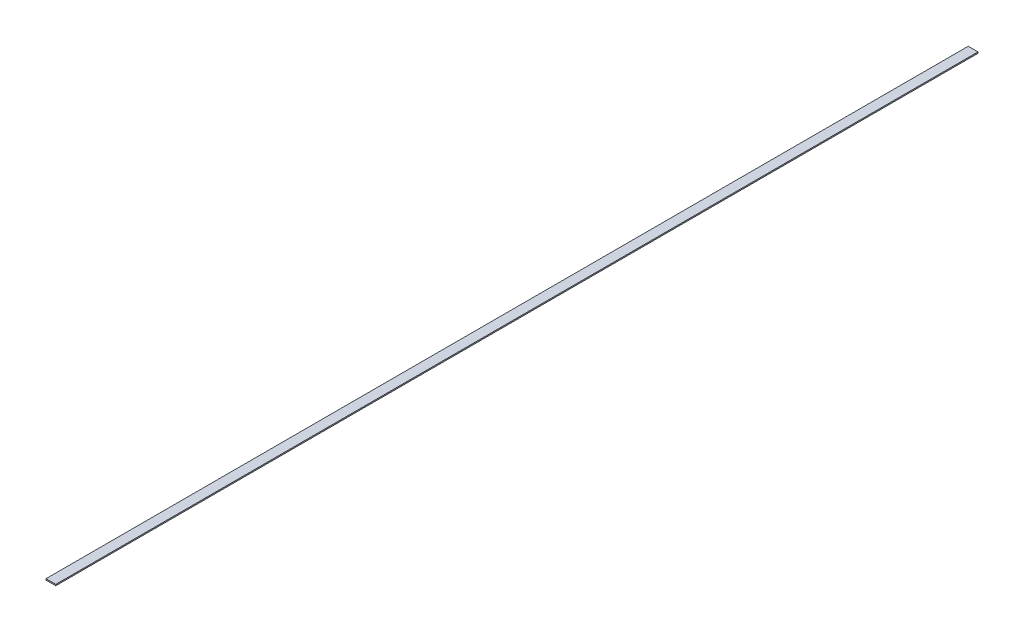
ISO-10303-21;
HEADER;
FILE_DESCRIPTION(('STEP AP214'),'2;1');
FILE_NAME('part.step','',(''),(''),'','','');
FILE_SCHEMA(('AUTOMOTIVE_DESIGN { 1 0 10303 214 1 1 1 1 }'));
ENDSEC;
DATA;
#1=APPLICATION_CONTEXT('core data for automotive mechanical design processes');
#2=APPLICATION_PROTOCOL_DEFINITION('international standard','automotive_design',2000,#1);
#3=PRODUCT_CONTEXT('',#1,'mechanical');
#4=PRODUCT('Part','Part','',(#3));
#5=PRODUCT_RELATED_PRODUCT_CATEGORY('part','',(#4));
#6=PRODUCT_DEFINITION_FORMATION('','',#4);
#7=PRODUCT_DEFINITION_CONTEXT('part definition',#1,'design');
#8=PRODUCT_DEFINITION('design','',#6,#7);
#9=PRODUCT_DEFINITION_SHAPE('','',#8);
#10=(LENGTH_UNIT() NAMED_UNIT(*) SI_UNIT(.MILLI.,.METRE.));
#11=(NAMED_UNIT(*) PLANE_ANGLE_UNIT() SI_UNIT($,.RADIAN.));
#12=(NAMED_UNIT(*) SI_UNIT($,.STERADIAN.) SOLID_ANGLE_UNIT());
#13=UNCERTAINTY_MEASURE_WITH_UNIT(LENGTH_MEASURE(1.E-05),#10,'distance_accuracy_value','');
#14=(GEOMETRIC_REPRESENTATION_CONTEXT(3) GLOBAL_UNCERTAINTY_ASSIGNED_CONTEXT((#13)) GLOBAL_UNIT_ASSIGNED_CONTEXT((#10,
#11,#12)) REPRESENTATION_CONTEXT('',''));
#15=CARTESIAN_POINT('',(0.,0.,0.));
#16=DIRECTION('',(0.,0.,1.));
#17=DIRECTION('',(1.,0.,0.));
#18=AXIS2_PLACEMENT_3D('',#15,#16,#17);
#19=CARTESIAN_POINT('',(-7.93750000000004,2.03199999999999,0.));
#20=DIRECTION('',(1.,0.,0.));
#21=DIRECTION('',(0.,0.,-1.));
#22=AXIS2_PLACEMENT_3D('',#19,#20,#21);
#23=PLANE('',#22);
#24=DIRECTION('',(0.,0.,1.));
#25=VECTOR('',#24,1.);
#26=CARTESIAN_POINT('',(-7.93750000000004,0.,0.));
#27=LINE('',#26,#25);
#28=CARTESIAN_POINT('',(-7.93749999999993,0.,-1498.6));
#29=VERTEX_POINT('',#28);
#30=CARTESIAN_POINT('',(-7.93750000000004,0.,0.));
#31=VERTEX_POINT('',#30);
#32=EDGE_CURVE('E76',#29,#31,#27,.T.);
#33=ORIENTED_EDGE('',*,*,#32,.T.);
#34=DIRECTION('',(0.,-1.,0.));
#35=VECTOR('',#34,1.);
#36=CARTESIAN_POINT('',(-7.93750000000004,2.03199999999999,0.));
#37=LINE('',#36,#35);
#38=CARTESIAN_POINT('',(-7.93750000000004,2.03199999999999,0.));
#39=VERTEX_POINT('',#38);
#40=EDGE_CURVE('E11',#39,#31,#37,.T.);
#41=ORIENTED_EDGE('',*,*,#40,.F.);
#42=DIRECTION('',(0.,0.,1.));
#43=VECTOR('',#42,1.);
#44=CARTESIAN_POINT('',(-7.93750000000004,2.03199999999999,0.));
#45=LINE('',#44,#43);
#46=CARTESIAN_POINT('',(-7.93749999999993,2.03199999999996,-1498.6));
#47=VERTEX_POINT('',#46);
#48=EDGE_CURVE('E94',#47,#39,#45,.T.);
#49=ORIENTED_EDGE('',*,*,#48,.F.);
#50=DIRECTION('',(0.,-1.,0.));
#51=VECTOR('',#50,1.);
#52=CARTESIAN_POINT('',(-7.93749999999993,2.03199999999996,-1498.6));
#53=LINE('',#52,#51);
#54=EDGE_CURVE('E88',#47,#29,#53,.T.);
#55=ORIENTED_EDGE('',*,*,#54,.T.);
#56=EDGE_LOOP('',(#33,#41,#49,#55));
#57=FACE_BOUND('',#56,.T.);
#58=ADVANCED_FACE('F32',(#57),#23,.F.);
#59=CARTESIAN_POINT('',(-7.93750000000004,2.03199999999999,0.));
#60=DIRECTION('',(0.,0.,-1.));
#61=DIRECTION('',(-1.,0.,0.));
#62=AXIS2_PLACEMENT_3D('',#59,#60,#61);
#63=PLANE('',#62);
#64=DIRECTION('',(1.,0.,0.));
#65=VECTOR('',#64,1.);
#66=CARTESIAN_POINT('',(-7.93750000000004,0.,0.));
#67=LINE('',#66,#65);
#68=CARTESIAN_POINT('',(7.93749999999993,0.,0.));
#69=VERTEX_POINT('',#68);
#70=EDGE_CURVE('E72',#31,#69,#67,.T.);
#71=ORIENTED_EDGE('',*,*,#70,.T.);
#72=DIRECTION('',(0.,-1.,0.));
#73=VECTOR('',#72,1.);
#74=CARTESIAN_POINT('',(7.93750000000004,2.03199999999999,0.));
#75=LINE('',#74,#73);
#76=CARTESIAN_POINT('',(7.93750000000004,2.03199999999999,0.));
#77=VERTEX_POINT('',#76);
#78=EDGE_CURVE('E39',#77,#69,#75,.T.);
#79=ORIENTED_EDGE('',*,*,#78,.F.);
#80=DIRECTION('',(1.,0.,0.));
#81=VECTOR('',#80,1.);
#82=CARTESIAN_POINT('',(-7.93750000000004,2.03199999999999,0.));
#83=LINE('',#82,#81);
#84=EDGE_CURVE('E84',#39,#77,#83,.T.);
#85=ORIENTED_EDGE('',*,*,#84,.F.);
#86=ORIENTED_EDGE('',*,*,#40,.T.);
#87=EDGE_LOOP('',(#71,#79,#85,#86));
#88=FACE_BOUND('',#87,.T.);
#89=ADVANCED_FACE('F83',(#88),#63,.F.);
#90=CARTESIAN_POINT('',(7.93750000000004,2.03199999999999,0.));
#91=DIRECTION('',(-1.,0.,0.));
#92=DIRECTION('',(0.,0.,1.));
#93=AXIS2_PLACEMENT_3D('',#90,#91,#92);
#94=PLANE('',#93);
#95=DIRECTION('',(0.,0.,-1.));
#96=VECTOR('',#95,1.);
#97=CARTESIAN_POINT('',(7.93749999999993,0.,0.));
#98=LINE('',#97,#96);
#99=CARTESIAN_POINT('',(7.93750000000004,0.,-1498.6));
#100=VERTEX_POINT('',#99);
#101=EDGE_CURVE('E77',#69,#100,#98,.T.);
#102=ORIENTED_EDGE('',*,*,#101,.T.);
#103=DIRECTION('',(0.,-1.,0.));
#104=VECTOR('',#103,1.);
#105=CARTESIAN_POINT('',(7.93750000000004,2.03199999999996,-1498.6));
#106=LINE('',#105,#104);
#107=CARTESIAN_POINT('',(7.93750000000004,2.03199999999996,-1498.6));
#108=VERTEX_POINT('',#107);
#109=EDGE_CURVE('E100',#108,#100,#106,.T.);
#110=ORIENTED_EDGE('',*,*,#109,.F.);
#111=DIRECTION('',(0.,0.,-1.));
#112=VECTOR('',#111,1.);
#113=CARTESIAN_POINT('',(7.93750000000004,2.03199999999999,0.));
#114=LINE('',#113,#112);
#115=EDGE_CURVE('E51',#77,#108,#114,.T.);
#116=ORIENTED_EDGE('',*,*,#115,.F.);
#117=ORIENTED_EDGE('',*,*,#78,.T.);
#118=EDGE_LOOP('',(#102,#110,#116,#117));
#119=FACE_BOUND('',#118,.T.);
#120=ADVANCED_FACE('F103',(#119),#94,.F.);
#121=CARTESIAN_POINT('',(-7.93749999999993,2.03199999999996,-1498.6));
#122=DIRECTION('',(0.,0.,1.));
#123=DIRECTION('',(1.,0.,0.));
#124=AXIS2_PLACEMENT_3D('',#121,#122,#123);
#125=PLANE('',#124);
#126=DIRECTION('',(-1.,0.,0.));
#127=VECTOR('',#126,1.);
#128=CARTESIAN_POINT('',(-7.93749999999993,0.,-1498.6));
#129=LINE('',#128,#127);
#130=EDGE_CURVE('E92',#100,#29,#129,.T.);
#131=ORIENTED_EDGE('',*,*,#130,.T.);
#132=ORIENTED_EDGE('',*,*,#54,.F.);
#133=DIRECTION('',(-1.,0.,0.));
#134=VECTOR('',#133,1.);
#135=CARTESIAN_POINT('',(-7.93749999999993,2.03199999999996,-1498.6));
#136=LINE('',#135,#134);
#137=EDGE_CURVE('E46',#108,#47,#136,.T.);
#138=ORIENTED_EDGE('',*,*,#137,.F.);
#139=ORIENTED_EDGE('',*,*,#109,.T.);
#140=EDGE_LOOP('',(#131,#132,#138,#139));
#141=FACE_BOUND('',#140,.T.);
#142=ADVANCED_FACE('F105',(#141),#125,.F.);
#143=CARTESIAN_POINT('',(-7.93749999999993,2.03199999999996,-1498.6));
#144=DIRECTION('',(0.,-1.,0.));
#145=DIRECTION('',(0.,0.,-1.));
#146=AXIS2_PLACEMENT_3D('',#143,#144,#145);
#147=PLANE('',#146);
#148=ORIENTED_EDGE('',*,*,#48,.T.);
#149=ORIENTED_EDGE('',*,*,#84,.T.);
#150=ORIENTED_EDGE('',*,*,#115,.T.);
#151=ORIENTED_EDGE('',*,*,#137,.T.);
#152=EDGE_LOOP('',(#148,#149,#150,#151));
#153=FACE_BOUND('',#152,.T.);
#154=ADVANCED_FACE('F106',(#153),#147,.F.);
#155=CARTESIAN_POINT('',(-7.93749999999993,0.,-1498.6));
#156=DIRECTION('',(0.,-1.,0.));
#157=DIRECTION('',(0.,0.,-1.));
#158=AXIS2_PLACEMENT_3D('',#155,#156,#157);
#159=PLANE('',#158);
#160=ORIENTED_EDGE('',*,*,#32,.F.);
#161=ORIENTED_EDGE('',*,*,#130,.F.);
#162=ORIENTED_EDGE('',*,*,#101,.F.);
#163=ORIENTED_EDGE('',*,*,#70,.F.);
#164=EDGE_LOOP('',(#160,#161,#162,#163));
#165=FACE_BOUND('',#164,.T.);
#166=ADVANCED_FACE('F73',(#165),#159,.T.);
#167=CLOSED_SHELL('',(#58,#89,#120,#142,#154,#166));
#168=MANIFOLD_SOLID_BREP('B2',#167);
#169=ADVANCED_BREP_SHAPE_REPRESENTATION('',(#18,#168),#14);
#170=SHAPE_DEFINITION_REPRESENTATION(#9,#169);
ENDSEC;
END-ISO-10303-21;
